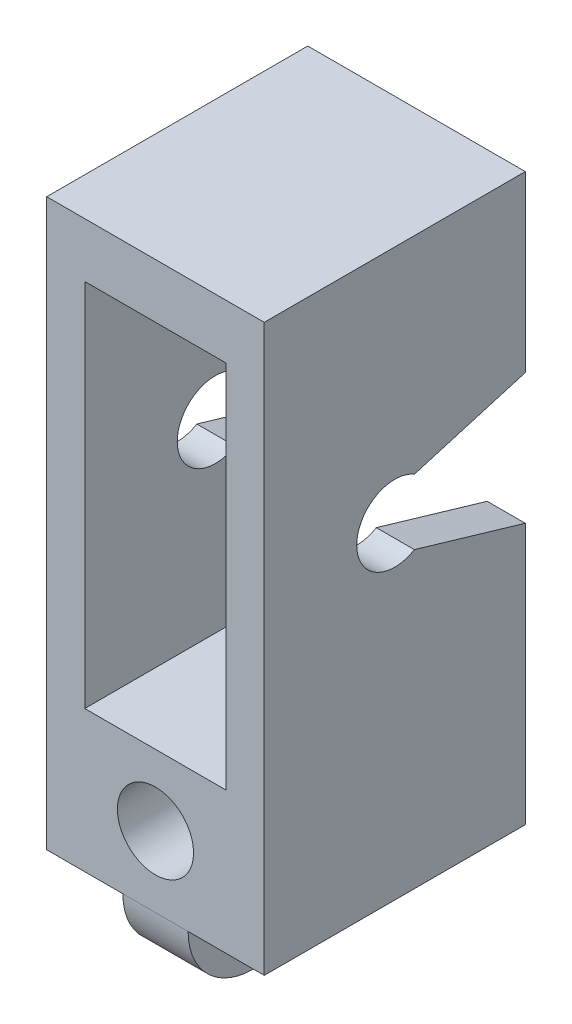
ISO-10303-21;
HEADER;
FILE_DESCRIPTION(('STEP AP214'),'2;1');
FILE_NAME('part.step','',(''),(''),'','','');
FILE_SCHEMA(('AUTOMOTIVE_DESIGN { 1 0 10303 214 1 1 1 1 }'));
ENDSEC;
DATA;
#1=APPLICATION_CONTEXT('core data for automotive mechanical design processes');
#2=APPLICATION_PROTOCOL_DEFINITION('international standard','automotive_design',2000,#1);
#3=PRODUCT_CONTEXT('',#1,'mechanical');
#4=PRODUCT('Part','Part','',(#3));
#5=PRODUCT_RELATED_PRODUCT_CATEGORY('part','',(#4));
#6=PRODUCT_DEFINITION_FORMATION('','',#4);
#7=PRODUCT_DEFINITION_CONTEXT('part definition',#1,'design');
#8=PRODUCT_DEFINITION('design','',#6,#7);
#9=PRODUCT_DEFINITION_SHAPE('','',#8);
#10=(LENGTH_UNIT() NAMED_UNIT(*) SI_UNIT(.MILLI.,.METRE.));
#11=(NAMED_UNIT(*) PLANE_ANGLE_UNIT() SI_UNIT($,.RADIAN.));
#12=(NAMED_UNIT(*) SI_UNIT($,.STERADIAN.) SOLID_ANGLE_UNIT());
#13=UNCERTAINTY_MEASURE_WITH_UNIT(LENGTH_MEASURE(1.E-05),#10,'distance_accuracy_value','');
#14=(GEOMETRIC_REPRESENTATION_CONTEXT(3) GLOBAL_UNCERTAINTY_ASSIGNED_CONTEXT((#13)) GLOBAL_UNIT_ASSIGNED_CONTEXT((#10,
#11,#12)) REPRESENTATION_CONTEXT('',''));
#15=CARTESIAN_POINT('',(0.,0.,0.));
#16=DIRECTION('',(0.,0.,1.));
#17=DIRECTION('',(1.,0.,0.));
#18=AXIS2_PLACEMENT_3D('',#15,#16,#17);
#19=CARTESIAN_POINT('',(5.,0.,-6.));
#20=DIRECTION('',(0.,0.,1.));
#21=DIRECTION('',(1.,0.,0.));
#22=AXIS2_PLACEMENT_3D('',#19,#20,#21);
#23=PLANE('',#22);
#24=DIRECTION('',(0.,-1.,0.));
#25=VECTOR('',#24,1.);
#26=CARTESIAN_POINT('',(1.5,5.,-6.));
#27=LINE('',#26,#25);
#28=CARTESIAN_POINT('',(1.5,6.5,-6.));
#29=VERTEX_POINT('',#28);
#30=CARTESIAN_POINT('',(1.5,5.,-6.));
#31=VERTEX_POINT('',#30);
#32=EDGE_CURVE('E287',#29,#31,#27,.T.);
#33=ORIENTED_EDGE('',*,*,#32,.F.);
#34=DIRECTION('',(1.,0.,0.));
#35=VECTOR('',#34,1.);
#36=CARTESIAN_POINT('',(5.,6.5,-6.));
#37=LINE('',#36,#35);
#38=CARTESIAN_POINT('',(3.25,6.5,-6.));
#39=VERTEX_POINT('',#38);
#40=EDGE_CURVE('E364',#29,#39,#37,.T.);
#41=ORIENTED_EDGE('',*,*,#40,.T.);
#42=DIRECTION('',(0.,1.,0.));
#43=VECTOR('',#42,1.);
#44=CARTESIAN_POINT('',(3.25,0.,-6.));
#45=LINE('',#44,#43);
#46=CARTESIAN_POINT('',(3.25,12.,-6.));
#47=VERTEX_POINT('',#46);
#48=EDGE_CURVE('E386',#39,#47,#45,.T.);
#49=ORIENTED_EDGE('',*,*,#48,.T.);
#50=DIRECTION('',(-1.,0.,0.));
#51=VECTOR('',#50,1.);
#52=CARTESIAN_POINT('',(5.,12.,-6.));
#53=LINE('',#52,#51);
#54=CARTESIAN_POINT('',(5.,12.,-6.));
#55=VERTEX_POINT('',#54);
#56=EDGE_CURVE('E472',#55,#47,#53,.T.);
#57=ORIENTED_EDGE('',*,*,#56,.F.);
#58=DIRECTION('',(0.,1.,0.));
#59=VECTOR('',#58,1.);
#60=CARTESIAN_POINT('',(5.,0.,-6.));
#61=LINE('',#60,#59);
#62=CARTESIAN_POINT('',(5.,0.,-6.));
#63=VERTEX_POINT('',#62);
#64=EDGE_CURVE('E408',#63,#55,#61,.T.);
#65=ORIENTED_EDGE('',*,*,#64,.F.);
#66=DIRECTION('',(-1.,0.,0.));
#67=VECTOR('',#66,1.);
#68=CARTESIAN_POINT('',(5.,0.,-6.));
#69=LINE('',#68,#67);
#70=CARTESIAN_POINT('',(1.5,0.,-6.));
#71=VERTEX_POINT('',#70);
#72=EDGE_CURVE('E447',#63,#71,#69,.T.);
#73=ORIENTED_EDGE('',*,*,#72,.T.);
#74=DIRECTION('',(0.,-1.,0.));
#75=VECTOR('',#74,1.);
#76=CARTESIAN_POINT('',(1.5,1.5,-6.));
#77=LINE('',#76,#75);
#78=CARTESIAN_POINT('',(1.5,1.5,-6.));
#79=VERTEX_POINT('',#78);
#80=EDGE_CURVE('E280',#79,#71,#77,.T.);
#81=ORIENTED_EDGE('',*,*,#80,.F.);
#82=DIRECTION('',(-1.,0.,0.));
#83=VECTOR('',#82,1.);
#84=CARTESIAN_POINT('',(1.5,1.5,-6.));
#85=LINE('',#84,#83);
#86=CARTESIAN_POINT('',(0.,1.5,-6.));
#87=VERTEX_POINT('',#86);
#88=EDGE_CURVE('E306',#79,#87,#85,.T.);
#89=ORIENTED_EDGE('',*,*,#88,.T.);
#90=CARTESIAN_POINT('',(0.,3.25,-6.));
#91=DIRECTION('',(0.,0.,1.));
#92=DIRECTION('',(1.,0.,0.));
#93=AXIS2_PLACEMENT_3D('',#90,#91,#92);
#94=CIRCLE('',#93,1.75);
#95=CARTESIAN_POINT('',(0.,5.,-6.));
#96=VERTEX_POINT('',#95);
#97=EDGE_CURVE('E314',#87,#96,#94,.T.);
#98=ORIENTED_EDGE('',*,*,#97,.T.);
#99=DIRECTION('',(-1.,0.,0.));
#100=VECTOR('',#99,1.);
#101=CARTESIAN_POINT('',(1.5,5.,-6.));
#102=LINE('',#101,#100);
#103=EDGE_CURVE('E297',#31,#96,#102,.T.);
#104=ORIENTED_EDGE('',*,*,#103,.F.);
#105=EDGE_LOOP('',(#33,#41,#49,#57,#65,#73,#81,#89,#98,#104));
#106=FACE_BOUND('',#105,.T.);
#107=ADVANCED_FACE('F33',(#106),#23,.F.);
#108=CARTESIAN_POINT('',(-1.5,5.,-6.));
#109=VERTEX_POINT('',#108);
#110=EDGE_CURVE('E289',#96,#109,#102,.T.);
#111=ORIENTED_EDGE('',*,*,#110,.F.);
#112=EDGE_CURVE('E315',#96,#87,#94,.T.);
#113=ORIENTED_EDGE('',*,*,#112,.T.);
#114=CARTESIAN_POINT('',(-1.5,1.5,-6.));
#115=VERTEX_POINT('',#114);
#116=EDGE_CURVE('E305',#87,#115,#85,.T.);
#117=ORIENTED_EDGE('',*,*,#116,.T.);
#118=DIRECTION('',(0.,-1.,0.));
#119=VECTOR('',#118,1.);
#120=CARTESIAN_POINT('',(-1.5,1.5,-6.));
#121=LINE('',#120,#119);
#122=CARTESIAN_POINT('',(-1.5,0.,-6.));
#123=VERTEX_POINT('',#122);
#124=EDGE_CURVE('E271',#115,#123,#121,.T.);
#125=ORIENTED_EDGE('',*,*,#124,.T.);
#126=CARTESIAN_POINT('',(-5.,0.,-6.));
#127=VERTEX_POINT('',#126);
#128=EDGE_CURVE('E426',#123,#127,#69,.T.);
#129=ORIENTED_EDGE('',*,*,#128,.T.);
#130=DIRECTION('',(0.,1.,0.));
#131=VECTOR('',#130,1.);
#132=CARTESIAN_POINT('',(-5.,0.,-6.));
#133=LINE('',#132,#131);
#134=CARTESIAN_POINT('',(-5.,12.,-6.));
#135=VERTEX_POINT('',#134);
#136=EDGE_CURVE('E407',#127,#135,#133,.T.);
#137=ORIENTED_EDGE('',*,*,#136,.T.);
#138=CARTESIAN_POINT('',(-3.25,12.,-6.));
#139=VERTEX_POINT('',#138);
#140=EDGE_CURVE('E471',#139,#135,#53,.T.);
#141=ORIENTED_EDGE('',*,*,#140,.F.);
#142=DIRECTION('',(0.,-1.,0.));
#143=VECTOR('',#142,1.);
#144=CARTESIAN_POINT('',(-3.25,0.,-6.));
#145=LINE('',#144,#143);
#146=CARTESIAN_POINT('',(-3.25,6.5,-6.));
#147=VERTEX_POINT('',#146);
#148=EDGE_CURVE('E404',#139,#147,#145,.T.);
#149=ORIENTED_EDGE('',*,*,#148,.T.);
#150=CARTESIAN_POINT('',(-1.5,6.5,-6.));
#151=VERTEX_POINT('',#150);
#152=EDGE_CURVE('E371',#147,#151,#37,.T.);
#153=ORIENTED_EDGE('',*,*,#152,.T.);
#154=DIRECTION('',(0.,-1.,0.));
#155=VECTOR('',#154,1.);
#156=CARTESIAN_POINT('',(-1.5,5.,-6.));
#157=LINE('',#156,#155);
#158=EDGE_CURVE('E281',#151,#109,#157,.T.);
#159=ORIENTED_EDGE('',*,*,#158,.T.);
#160=EDGE_LOOP('',(#111,#113,#117,#125,#129,#137,#141,#149,#153,#159));
#161=FACE_BOUND('',#160,.T.);
#162=ADVANCED_FACE('F515',(#161),#23,.F.);
#163=CARTESIAN_POINT('',(5.,13.5,-0.901387818865997));
#164=DIRECTION('',(0.,-0.95934470842308,0.282237011075151));
#165=DIRECTION('',(0.,-0.282237011075151,-0.95934470842308));
#166=AXIS2_PLACEMENT_3D('',#163,#164,#165);
#167=PLANE('',#166);
#168=DIRECTION('',(-1.,0.,0.));
#169=VECTOR('',#168,1.);
#170=CARTESIAN_POINT('',(5.,13.5,-0.901387818865997));
#171=LINE('',#170,#169);
#172=CARTESIAN_POINT('',(-3.25,13.5,-0.901387818865997));
#173=VERTEX_POINT('',#172);
#174=CARTESIAN_POINT('',(-5.,13.5,-0.901387818865997));
#175=VERTEX_POINT('',#174);
#176=EDGE_CURVE('E467',#173,#175,#171,.T.);
#177=ORIENTED_EDGE('',*,*,#176,.F.);
#178=DIRECTION('',(0.,-0.282237011075151,-0.95934470842308));
#179=VECTOR('',#178,1.);
#180=CARTESIAN_POINT('',(-3.25,13.5,-0.901387818865998));
#181=LINE('',#180,#179);
#182=EDGE_CURVE('E401',#173,#139,#181,.T.);
#183=ORIENTED_EDGE('',*,*,#182,.T.);
#184=ORIENTED_EDGE('',*,*,#140,.T.);
#185=DIRECTION('',(0.,0.282237011075151,0.95934470842308));
#186=VECTOR('',#185,1.);
#187=CARTESIAN_POINT('',(-5.,13.5,-0.901387818865997));
#188=LINE('',#187,#186);
#189=EDGE_CURVE('E429',#135,#175,#188,.T.);
#190=ORIENTED_EDGE('',*,*,#189,.T.);
#191=EDGE_LOOP('',(#177,#183,#184,#190));
#192=FACE_BOUND('',#191,.T.);
#193=ADVANCED_FACE('F521',(#192),#167,.F.);
#194=CARTESIAN_POINT('',(5.,15.,0.));
#195=DIRECTION('',(-1.,0.,0.));
#196=DIRECTION('',(0.,0.,1.));
#197=AXIS2_PLACEMENT_3D('',#194,#195,#196);
#198=CYLINDRICAL_SURFACE('',#197,1.75);
#199=DIRECTION('',(-1.,0.,0.));
#200=VECTOR('',#199,1.);
#201=CARTESIAN_POINT('',(5.,16.5,-0.901387818865997));
#202=LINE('',#201,#200);
#203=CARTESIAN_POINT('',(-3.25,16.5,-0.901387818865997));
#204=VERTEX_POINT('',#203);
#205=CARTESIAN_POINT('',(-5.,16.5,-0.901387818865997));
#206=VERTEX_POINT('',#205);
#207=EDGE_CURVE('E463',#204,#206,#202,.T.);
#208=ORIENTED_EDGE('',*,*,#207,.F.);
#209=CARTESIAN_POINT('',(-3.25,15.,0.));
#210=DIRECTION('',(-1.,0.,0.));
#211=DIRECTION('',(0.,-1.,0.));
#212=AXIS2_PLACEMENT_3D('',#209,#210,#211);
#213=CIRCLE('',#212,1.75);
#214=EDGE_CURVE('E398',#204,#173,#213,.F.);
#215=ORIENTED_EDGE('',*,*,#214,.T.);
#216=ORIENTED_EDGE('',*,*,#176,.T.);
#217=CARTESIAN_POINT('',(-5.,15.,0.));
#218=DIRECTION('',(-1.,0.,0.));
#219=DIRECTION('',(0.,0.,-1.));
#220=AXIS2_PLACEMENT_3D('',#217,#218,#219);
#221=CIRCLE('',#220,1.75);
#222=EDGE_CURVE('E432',#175,#206,#221,.T.);
#223=ORIENTED_EDGE('',*,*,#222,.T.);
#224=EDGE_LOOP('',(#208,#215,#216,#223));
#225=FACE_BOUND('',#224,.T.);
#226=ADVANCED_FACE('F547',(#225),#198,.F.);
#227=CARTESIAN_POINT('',(5.,16.5,-0.901387818865997));
#228=DIRECTION('',(0.,0.95934470842308,0.282237011075151));
#229=DIRECTION('',(0.,-0.282237011075151,0.95934470842308));
#230=AXIS2_PLACEMENT_3D('',#227,#228,#229);
#231=PLANE('',#230);
#232=DIRECTION('',(-1.,0.,0.));
#233=VECTOR('',#232,1.);
#234=CARTESIAN_POINT('',(5.,18.,-6.));
#235=LINE('',#234,#233);
#236=CARTESIAN_POINT('',(-3.25,18.,-6.));
#237=VERTEX_POINT('',#236);
#238=CARTESIAN_POINT('',(-5.,18.,-6.));
#239=VERTEX_POINT('',#238);
#240=EDGE_CURVE('E459',#237,#239,#235,.T.);
#241=ORIENTED_EDGE('',*,*,#240,.F.);
#242=DIRECTION('',(0.,-0.282237011075151,0.95934470842308));
#243=VECTOR('',#242,1.);
#244=CARTESIAN_POINT('',(-3.25,16.5,-0.901387818865997));
#245=LINE('',#244,#243);
#246=EDGE_CURVE('E395',#237,#204,#245,.T.);
#247=ORIENTED_EDGE('',*,*,#246,.T.);
#248=ORIENTED_EDGE('',*,*,#207,.T.);
#249=DIRECTION('',(0.,0.282237011075151,-0.95934470842308));
#250=VECTOR('',#249,1.);
#251=CARTESIAN_POINT('',(-5.,16.5,-0.901387818865997));
#252=LINE('',#251,#250);
#253=EDGE_CURVE('E435',#206,#239,#252,.T.);
#254=ORIENTED_EDGE('',*,*,#253,.T.);
#255=EDGE_LOOP('',(#241,#247,#248,#254));
#256=FACE_BOUND('',#255,.T.);
#257=ADVANCED_FACE('F551',(#256),#231,.F.);
#258=ORIENTED_EDGE('',*,*,#56,.T.);
#259=DIRECTION('',(0.,0.282237011075151,0.95934470842308));
#260=VECTOR('',#259,1.);
#261=CARTESIAN_POINT('',(3.25,13.5,-0.901387818865998));
#262=LINE('',#261,#260);
#263=CARTESIAN_POINT('',(3.25,13.5,-0.901387818865997));
#264=VERTEX_POINT('',#263);
#265=EDGE_CURVE('E383',#47,#264,#262,.T.);
#266=ORIENTED_EDGE('',*,*,#265,.T.);
#267=CARTESIAN_POINT('',(5.,13.5,-0.901387818865997));
#268=VERTEX_POINT('',#267);
#269=EDGE_CURVE('E468',#268,#264,#171,.T.);
#270=ORIENTED_EDGE('',*,*,#269,.F.);
#271=DIRECTION('',(0.,0.282237011075151,0.95934470842308));
#272=VECTOR('',#271,1.);
#273=CARTESIAN_POINT('',(5.,13.5,-0.901387818865997));
#274=LINE('',#273,#272);
#275=EDGE_CURVE('E411',#55,#268,#274,.T.);
#276=ORIENTED_EDGE('',*,*,#275,.F.);
#277=EDGE_LOOP('',(#258,#266,#270,#276));
#278=FACE_BOUND('',#277,.T.);
#279=ADVANCED_FACE('F572',(#278),#167,.F.);
#280=ORIENTED_EDGE('',*,*,#269,.T.);
#281=CARTESIAN_POINT('',(3.25,15.,0.));
#282=DIRECTION('',(1.,0.,0.));
#283=DIRECTION('',(0.,1.,0.));
#284=AXIS2_PLACEMENT_3D('',#281,#282,#283);
#285=CIRCLE('',#284,1.75);
#286=CARTESIAN_POINT('',(3.25,16.5,-0.901387818865997));
#287=VERTEX_POINT('',#286);
#288=EDGE_CURVE('E380',#264,#287,#285,.F.);
#289=ORIENTED_EDGE('',*,*,#288,.T.);
#290=CARTESIAN_POINT('',(5.,16.5,-0.901387818865997));
#291=VERTEX_POINT('',#290);
#292=EDGE_CURVE('E464',#291,#287,#202,.T.);
#293=ORIENTED_EDGE('',*,*,#292,.F.);
#294=CARTESIAN_POINT('',(5.,15.,0.));
#295=DIRECTION('',(-1.,0.,0.));
#296=DIRECTION('',(0.,0.,-1.));
#297=AXIS2_PLACEMENT_3D('',#294,#295,#296);
#298=CIRCLE('',#297,1.75);
#299=EDGE_CURVE('E414',#268,#291,#298,.T.);
#300=ORIENTED_EDGE('',*,*,#299,.F.);
#301=EDGE_LOOP('',(#280,#289,#293,#300));
#302=FACE_BOUND('',#301,.T.);
#303=ADVANCED_FACE('F737',(#302),#198,.F.);
#304=ORIENTED_EDGE('',*,*,#292,.T.);
#305=DIRECTION('',(0.,0.282237011075151,-0.95934470842308));
#306=VECTOR('',#305,1.);
#307=CARTESIAN_POINT('',(3.25,16.5,-0.901387818865997));
#308=LINE('',#307,#306);
#309=CARTESIAN_POINT('',(3.25,18.,-6.));
#310=VERTEX_POINT('',#309);
#311=EDGE_CURVE('E377',#287,#310,#308,.T.);
#312=ORIENTED_EDGE('',*,*,#311,.T.);
#313=CARTESIAN_POINT('',(5.,18.,-6.));
#314=VERTEX_POINT('',#313);
#315=EDGE_CURVE('E460',#314,#310,#235,.T.);
#316=ORIENTED_EDGE('',*,*,#315,.F.);
#317=DIRECTION('',(0.,0.282237011075151,-0.95934470842308));
#318=VECTOR('',#317,1.);
#319=CARTESIAN_POINT('',(5.,16.5,-0.901387818865997));
#320=LINE('',#319,#318);
#321=EDGE_CURVE('E416',#291,#314,#320,.T.);
#322=ORIENTED_EDGE('',*,*,#321,.F.);
#323=EDGE_LOOP('',(#304,#312,#316,#322));
#324=FACE_BOUND('',#323,.T.);
#325=ADVANCED_FACE('F735',(#324),#231,.F.);
#326=CARTESIAN_POINT('',(5.,18.,-6.));
#327=DIRECTION('',(0.,0.,1.));
#328=DIRECTION('',(1.,0.,0.));
#329=AXIS2_PLACEMENT_3D('',#326,#327,#328);
#330=PLANE('',#329);
#331=DIRECTION('',(-1.,0.,0.));
#332=VECTOR('',#331,1.);
#333=CARTESIAN_POINT('',(5.,23.5,-6.));
#334=LINE('',#333,#332);
#335=CARTESIAN_POINT('',(3.25,23.5,-6.));
#336=VERTEX_POINT('',#335);
#337=CARTESIAN_POINT('',(-3.25,23.5,-6.));
#338=VERTEX_POINT('',#337);
#339=EDGE_CURVE('E389',#336,#338,#334,.T.);
#340=ORIENTED_EDGE('',*,*,#339,.T.);
#341=DIRECTION('',(0.,-1.,0.));
#342=VECTOR('',#341,1.);
#343=CARTESIAN_POINT('',(-3.25,18.,-6.));
#344=LINE('',#343,#342);
#345=EDGE_CURVE('E392',#338,#237,#344,.T.);
#346=ORIENTED_EDGE('',*,*,#345,.T.);
#347=ORIENTED_EDGE('',*,*,#240,.T.);
#348=DIRECTION('',(0.,1.,0.));
#349=VECTOR('',#348,1.);
#350=CARTESIAN_POINT('',(-5.,18.,-6.));
#351=LINE('',#350,#349);
#352=CARTESIAN_POINT('',(-5.,26.,-6.));
#353=VERTEX_POINT('',#352);
#354=EDGE_CURVE('E438',#239,#353,#351,.T.);
#355=ORIENTED_EDGE('',*,*,#354,.T.);
#356=DIRECTION('',(-1.,0.,0.));
#357=VECTOR('',#356,1.);
#358=CARTESIAN_POINT('',(5.,26.,-6.));
#359=LINE('',#358,#357);
#360=CARTESIAN_POINT('',(5.,26.,-6.));
#361=VERTEX_POINT('',#360);
#362=EDGE_CURVE('E456',#361,#353,#359,.T.);
#363=ORIENTED_EDGE('',*,*,#362,.F.);
#364=DIRECTION('',(0.,1.,0.));
#365=VECTOR('',#364,1.);
#366=CARTESIAN_POINT('',(5.,18.,-6.));
#367=LINE('',#366,#365);
#368=EDGE_CURVE('E418',#314,#361,#367,.T.);
#369=ORIENTED_EDGE('',*,*,#368,.F.);
#370=ORIENTED_EDGE('',*,*,#315,.T.);
#371=DIRECTION('',(0.,1.,0.));
#372=VECTOR('',#371,1.);
#373=CARTESIAN_POINT('',(3.25,18.,-6.));
#374=LINE('',#373,#372);
#375=EDGE_CURVE('E374',#310,#336,#374,.T.);
#376=ORIENTED_EDGE('',*,*,#375,.T.);
#377=EDGE_LOOP('',(#340,#346,#347,#355,#363,#369,#370,#376));
#378=FACE_BOUND('',#377,.T.);
#379=ADVANCED_FACE('F554',(#378),#330,.F.);
#380=CARTESIAN_POINT('',(5.,26.,-6.));
#381=DIRECTION('',(0.,-1.,0.));
#382=DIRECTION('',(0.,0.,-1.));
#383=AXIS2_PLACEMENT_3D('',#380,#381,#382);
#384=PLANE('',#383);
#385=DIRECTION('',(0.,0.,1.));
#386=VECTOR('',#385,1.);
#387=CARTESIAN_POINT('',(-5.,26.,-6.));
#388=LINE('',#387,#386);
#389=CARTESIAN_POINT('',(-5.,26.,6.));
#390=VERTEX_POINT('',#389);
#391=EDGE_CURVE('E440',#353,#390,#388,.T.);
#392=ORIENTED_EDGE('',*,*,#391,.T.);
#393=DIRECTION('',(-1.,0.,0.));
#394=VECTOR('',#393,1.);
#395=CARTESIAN_POINT('',(5.,26.,6.));
#396=LINE('',#395,#394);
#397=CARTESIAN_POINT('',(5.,26.,6.));
#398=VERTEX_POINT('',#397);
#399=EDGE_CURVE('E453',#398,#390,#396,.T.);
#400=ORIENTED_EDGE('',*,*,#399,.F.);
#401=DIRECTION('',(0.,0.,1.));
#402=VECTOR('',#401,1.);
#403=CARTESIAN_POINT('',(5.,26.,-6.));
#404=LINE('',#403,#402);
#405=EDGE_CURVE('E420',#361,#398,#404,.T.);
#406=ORIENTED_EDGE('',*,*,#405,.F.);
#407=ORIENTED_EDGE('',*,*,#362,.T.);
#408=EDGE_LOOP('',(#392,#400,#406,#407));
#409=FACE_BOUND('',#408,.T.);
#410=ADVANCED_FACE('F728',(#409),#384,.F.);
#411=CARTESIAN_POINT('',(5.,0.,6.));
#412=DIRECTION('',(0.,0.,-1.));
#413=DIRECTION('',(-1.,0.,0.));
#414=AXIS2_PLACEMENT_3D('',#411,#412,#413);
#415=PLANE('',#414);
#416=CARTESIAN_POINT('',(0.,3.25,6.));
#417=DIRECTION('',(0.,0.,-1.));
#418=DIRECTION('',(-1.,0.,0.));
#419=AXIS2_PLACEMENT_3D('',#416,#417,#418);
#420=CIRCLE('',#419,1.75);
#421=CARTESIAN_POINT('',(-1.75,3.25,6.));
#422=VERTEX_POINT('',#421);
#423=EDGE_CURVE('E311',#422,#422,#420,.T.);
#424=ORIENTED_EDGE('',*,*,#423,.T.);
#425=EDGE_LOOP('',(#424));
#426=FACE_BOUND('',#425,.T.);
#427=DIRECTION('',(1.,0.,0.));
#428=VECTOR('',#427,1.);
#429=CARTESIAN_POINT('',(-3.25,6.5,6.));
#430=LINE('',#429,#428);
#431=CARTESIAN_POINT('',(-3.25,6.5,6.));
#432=VERTEX_POINT('',#431);
#433=CARTESIAN_POINT('',(3.25,6.5,6.));
#434=VERTEX_POINT('',#433);
#435=EDGE_CURVE('E352',#432,#434,#430,.T.);
#436=ORIENTED_EDGE('',*,*,#435,.F.);
#437=DIRECTION('',(0.,-1.,0.));
#438=VECTOR('',#437,1.);
#439=CARTESIAN_POINT('',(-3.25,23.5,6.));
#440=LINE('',#439,#438);
#441=CARTESIAN_POINT('',(-3.25,23.5,6.));
#442=VERTEX_POINT('',#441);
#443=EDGE_CURVE('E344',#442,#432,#440,.T.);
#444=ORIENTED_EDGE('',*,*,#443,.F.);
#445=DIRECTION('',(-1.,0.,0.));
#446=VECTOR('',#445,1.);
#447=CARTESIAN_POINT('',(-3.25,23.5,6.));
#448=LINE('',#447,#446);
#449=CARTESIAN_POINT('',(3.25,23.5,6.));
#450=VERTEX_POINT('',#449);
#451=EDGE_CURVE('E358',#450,#442,#448,.T.);
#452=ORIENTED_EDGE('',*,*,#451,.F.);
#453=DIRECTION('',(0.,1.,0.));
#454=VECTOR('',#453,1.);
#455=CARTESIAN_POINT('',(3.25,23.5,6.));
#456=LINE('',#455,#454);
#457=EDGE_CURVE('E355',#434,#450,#456,.T.);
#458=ORIENTED_EDGE('',*,*,#457,.F.);
#459=EDGE_LOOP('',(#436,#444,#452,#458));
#460=FACE_BOUND('',#459,.T.);
#461=DIRECTION('',(0.,-1.,0.));
#462=VECTOR('',#461,1.);
#463=CARTESIAN_POINT('',(-5.,0.,6.));
#464=LINE('',#463,#462);
#465=CARTESIAN_POINT('',(-5.,0.,6.));
#466=VERTEX_POINT('',#465);
#467=EDGE_CURVE('E442',#390,#466,#464,.T.);
#468=ORIENTED_EDGE('',*,*,#467,.T.);
#469=DIRECTION('',(-1.,0.,0.));
#470=VECTOR('',#469,1.);
#471=CARTESIAN_POINT('',(5.,0.,6.));
#472=LINE('',#471,#470);
#473=CARTESIAN_POINT('',(-1.5,0.,6.));
#474=VERTEX_POINT('',#473);
#475=EDGE_CURVE('E450',#474,#466,#472,.T.);
#476=ORIENTED_EDGE('',*,*,#475,.F.);
#477=DIRECTION('',(-1.,0.,0.));
#478=VECTOR('',#477,1.);
#479=CARTESIAN_POINT('',(1.5,0.,6.));
#480=LINE('',#479,#478);
#481=CARTESIAN_POINT('',(1.5,0.,6.));
#482=VERTEX_POINT('',#481);
#483=EDGE_CURVE('E715',#482,#474,#480,.T.);
#484=ORIENTED_EDGE('',*,*,#483,.F.);
#485=CARTESIAN_POINT('',(5.,0.,6.));
#486=VERTEX_POINT('',#485);
#487=EDGE_CURVE('E451',#486,#482,#472,.T.);
#488=ORIENTED_EDGE('',*,*,#487,.F.);
#489=DIRECTION('',(0.,-1.,0.));
#490=VECTOR('',#489,1.);
#491=CARTESIAN_POINT('',(5.,0.,6.));
#492=LINE('',#491,#490);
#493=EDGE_CURVE('E422',#398,#486,#492,.T.);
#494=ORIENTED_EDGE('',*,*,#493,.F.);
#495=ORIENTED_EDGE('',*,*,#399,.T.);
#496=EDGE_LOOP('',(#468,#476,#484,#488,#494,#495));
#497=FACE_BOUND('',#496,.T.);
#498=ADVANCED_FACE('F565',(#426,#460,#497),#415,.F.);
#499=CARTESIAN_POINT('',(5.,0.,6.));
#500=DIRECTION('',(0.,1.,0.));
#501=DIRECTION('',(0.,0.,1.));
#502=AXIS2_PLACEMENT_3D('',#499,#500,#501);
#503=PLANE('',#502);
#504=DIRECTION('',(-1.,0.,0.));
#505=VECTOR('',#504,1.);
#506=CARTESIAN_POINT('',(1.5,0.,1.6));
#507=LINE('',#506,#505);
#508=CARTESIAN_POINT('',(1.5,0.,1.6));
#509=VERTEX_POINT('',#508);
#510=CARTESIAN_POINT('',(-1.5,0.,1.6));
#511=VERTEX_POINT('',#510);
#512=EDGE_CURVE('E56',#509,#511,#507,.T.);
#513=ORIENTED_EDGE('',*,*,#512,.F.);
#514=DIRECTION('',(0.,0.,1.));
#515=VECTOR('',#514,1.);
#516=CARTESIAN_POINT('',(1.5,0.,1.6));
#517=LINE('',#516,#515);
#518=CARTESIAN_POINT('',(1.5,0.,0.));
#519=VERTEX_POINT('',#518);
#520=EDGE_CURVE('E250',#519,#509,#517,.T.);
#521=ORIENTED_EDGE('',*,*,#520,.F.);
#522=DIRECTION('',(1.,0.,0.));
#523=VECTOR('',#522,1.);
#524=CARTESIAN_POINT('',(-2.75,0.,0.));
#525=LINE('',#524,#523);
#526=CARTESIAN_POINT('',(2.75,0.,0.));
#527=VERTEX_POINT('',#526);
#528=EDGE_CURVE('E237',#519,#527,#525,.T.);
#529=ORIENTED_EDGE('',*,*,#528,.T.);
#530=DIRECTION('',(0.,0.,1.));
#531=VECTOR('',#530,1.);
#532=CARTESIAN_POINT('',(2.75,0.,-2.5));
#533=LINE('',#532,#531);
#534=CARTESIAN_POINT('',(2.75,0.,-2.5));
#535=VERTEX_POINT('',#534);
#536=EDGE_CURVE('E347',#535,#527,#533,.T.);
#537=ORIENTED_EDGE('',*,*,#536,.F.);
#538=DIRECTION('',(1.,0.,0.));
#539=VECTOR('',#538,1.);
#540=CARTESIAN_POINT('',(-2.75,0.,-2.5));
#541=LINE('',#540,#539);
#542=CARTESIAN_POINT('',(-2.75,0.,-2.5));
#543=VERTEX_POINT('',#542);
#544=EDGE_CURVE('E321',#543,#535,#541,.T.);
#545=ORIENTED_EDGE('',*,*,#544,.F.);
#546=DIRECTION('',(0.,0.,1.));
#547=VECTOR('',#546,1.);
#548=CARTESIAN_POINT('',(-2.75,0.,-2.5));
#549=LINE('',#548,#547);
#550=CARTESIAN_POINT('',(-2.75,0.,0.));
#551=VERTEX_POINT('',#550);
#552=EDGE_CURVE('E333',#543,#551,#549,.T.);
#553=ORIENTED_EDGE('',*,*,#552,.T.);
#554=CARTESIAN_POINT('',(-1.5,0.,0.));
#555=VERTEX_POINT('',#554);
#556=EDGE_CURVE('E247',#551,#555,#525,.T.);
#557=ORIENTED_EDGE('',*,*,#556,.T.);
#558=DIRECTION('',(0.,0.,1.));
#559=VECTOR('',#558,1.);
#560=CARTESIAN_POINT('',(-1.5,0.,1.6));
#561=LINE('',#560,#559);
#562=EDGE_CURVE('E705',#555,#511,#561,.T.);
#563=ORIENTED_EDGE('',*,*,#562,.T.);
#564=EDGE_LOOP('',(#513,#521,#529,#537,#545,#553,#557,#563));
#565=FACE_BOUND('',#564,.T.);
#566=ORIENTED_EDGE('',*,*,#487,.T.);
#567=DIRECTION('',(0.,0.,1.));
#568=VECTOR('',#567,1.);
#569=CARTESIAN_POINT('',(1.5,0.,4.4));
#570=LINE('',#569,#568);
#571=CARTESIAN_POINT('',(1.5,0.,4.4));
#572=VERTEX_POINT('',#571);
#573=EDGE_CURVE('E48',#572,#482,#570,.T.);
#574=ORIENTED_EDGE('',*,*,#573,.F.);
#575=DIRECTION('',(-1.,0.,0.));
#576=VECTOR('',#575,1.);
#577=CARTESIAN_POINT('',(1.5,0.,4.4));
#578=LINE('',#577,#576);
#579=CARTESIAN_POINT('',(-1.5,0.,4.4));
#580=VERTEX_POINT('',#579);
#581=EDGE_CURVE('E273',#572,#580,#578,.T.);
#582=ORIENTED_EDGE('',*,*,#581,.T.);
#583=DIRECTION('',(0.,0.,1.));
#584=VECTOR('',#583,1.);
#585=CARTESIAN_POINT('',(-1.5,0.,4.4));
#586=LINE('',#585,#584);
#587=EDGE_CURVE('E262',#580,#474,#586,.T.);
#588=ORIENTED_EDGE('',*,*,#587,.T.);
#589=ORIENTED_EDGE('',*,*,#475,.T.);
#590=DIRECTION('',(0.,0.,-1.));
#591=VECTOR('',#590,1.);
#592=CARTESIAN_POINT('',(-5.,0.,6.));
#593=LINE('',#592,#591);
#594=EDGE_CURVE('E412',#466,#127,#593,.T.);
#595=ORIENTED_EDGE('',*,*,#594,.T.);
#596=ORIENTED_EDGE('',*,*,#128,.F.);
#597=DIRECTION('',(-1.,0.,0.));
#598=VECTOR('',#597,1.);
#599=CARTESIAN_POINT('',(1.5,0.,-6.));
#600=LINE('',#599,#598);
#601=EDGE_CURVE('E302',#71,#123,#600,.T.);
#602=ORIENTED_EDGE('',*,*,#601,.F.);
#603=ORIENTED_EDGE('',*,*,#72,.F.);
#604=DIRECTION('',(0.,0.,-1.));
#605=VECTOR('',#604,1.);
#606=CARTESIAN_POINT('',(5.,0.,6.));
#607=LINE('',#606,#605);
#608=EDGE_CURVE('E424',#486,#63,#607,.T.);
#609=ORIENTED_EDGE('',*,*,#608,.F.);
#610=EDGE_LOOP('',(#566,#574,#582,#588,#589,#595,#596,#602,#603,#609));
#611=FACE_BOUND('',#610,.T.);
#612=ADVANCED_FACE('F252',(#565,#611),#503,.F.);
#613=CARTESIAN_POINT('',(5.,15.,0.));
#614=DIRECTION('',(1.,0.,0.));
#615=DIRECTION('',(0.,0.,-1.));
#616=AXIS2_PLACEMENT_3D('',#613,#614,#615);
#617=PLANE('',#616);
#618=ORIENTED_EDGE('',*,*,#64,.T.);
#619=ORIENTED_EDGE('',*,*,#275,.T.);
#620=ORIENTED_EDGE('',*,*,#299,.T.);
#621=ORIENTED_EDGE('',*,*,#321,.T.);
#622=ORIENTED_EDGE('',*,*,#368,.T.);
#623=ORIENTED_EDGE('',*,*,#405,.T.);
#624=ORIENTED_EDGE('',*,*,#493,.T.);
#625=ORIENTED_EDGE('',*,*,#608,.T.);
#626=EDGE_LOOP('',(#618,#619,#620,#621,#622,#623,#624,#625));
#627=FACE_BOUND('',#626,.T.);
#628=ADVANCED_FACE('F576',(#627),#617,.T.);
#629=CARTESIAN_POINT('',(-5.,15.,0.));
#630=DIRECTION('',(1.,0.,0.));
#631=DIRECTION('',(0.,0.,-1.));
#632=AXIS2_PLACEMENT_3D('',#629,#630,#631);
#633=PLANE('',#632);
#634=ORIENTED_EDGE('',*,*,#136,.F.);
#635=ORIENTED_EDGE('',*,*,#594,.F.);
#636=ORIENTED_EDGE('',*,*,#467,.F.);
#637=ORIENTED_EDGE('',*,*,#391,.F.);
#638=ORIENTED_EDGE('',*,*,#354,.F.);
#639=ORIENTED_EDGE('',*,*,#253,.F.);
#640=ORIENTED_EDGE('',*,*,#222,.F.);
#641=ORIENTED_EDGE('',*,*,#189,.F.);
#642=EDGE_LOOP('',(#634,#635,#636,#637,#638,#639,#640,#641));
#643=FACE_BOUND('',#642,.T.);
#644=ADVANCED_FACE('F726',(#643),#633,.F.);
#645=CARTESIAN_POINT('',(-3.25,23.5,-14.));
#646=DIRECTION('',(-1.,0.,0.));
#647=DIRECTION('',(0.,-1.,0.));
#648=AXIS2_PLACEMENT_3D('',#645,#646,#647);
#649=PLANE('',#648);
#650=ORIENTED_EDGE('',*,*,#182,.F.);
#651=ORIENTED_EDGE('',*,*,#214,.F.);
#652=ORIENTED_EDGE('',*,*,#246,.F.);
#653=ORIENTED_EDGE('',*,*,#345,.F.);
#654=DIRECTION('',(0.,0.,1.));
#655=VECTOR('',#654,1.);
#656=CARTESIAN_POINT('',(-3.25,23.5,-14.));
#657=LINE('',#656,#655);
#658=EDGE_CURVE('E362',#338,#442,#657,.T.);
#659=ORIENTED_EDGE('',*,*,#658,.T.);
#660=ORIENTED_EDGE('',*,*,#443,.T.);
#661=DIRECTION('',(0.,0.,1.));
#662=VECTOR('',#661,1.);
#663=CARTESIAN_POINT('',(-3.25,6.5,-14.));
#664=LINE('',#663,#662);
#665=EDGE_CURVE('E361',#147,#432,#664,.T.);
#666=ORIENTED_EDGE('',*,*,#665,.F.);
#667=ORIENTED_EDGE('',*,*,#148,.F.);
#668=EDGE_LOOP('',(#650,#651,#652,#653,#659,#660,#666,#667));
#669=FACE_BOUND('',#668,.T.);
#670=ADVANCED_FACE('F540',(#669),#649,.F.);
#671=CARTESIAN_POINT('',(-3.25,23.5,-14.));
#672=DIRECTION('',(0.,1.,0.));
#673=DIRECTION('',(0.,0.,1.));
#674=AXIS2_PLACEMENT_3D('',#671,#672,#673);
#675=PLANE('',#674);
#676=DIRECTION('',(0.,0.,1.));
#677=VECTOR('',#676,1.);
#678=CARTESIAN_POINT('',(3.25,23.5,-14.));
#679=LINE('',#678,#677);
#680=EDGE_CURVE('E365',#336,#450,#679,.T.);
#681=ORIENTED_EDGE('',*,*,#680,.T.);
#682=ORIENTED_EDGE('',*,*,#451,.T.);
#683=ORIENTED_EDGE('',*,*,#658,.F.);
#684=ORIENTED_EDGE('',*,*,#339,.F.);
#685=EDGE_LOOP('',(#681,#682,#683,#684));
#686=FACE_BOUND('',#685,.T.);
#687=ADVANCED_FACE('F559',(#686),#675,.F.);
#688=CARTESIAN_POINT('',(3.25,23.5,-14.));
#689=DIRECTION('',(1.,0.,0.));
#690=DIRECTION('',(0.,1.,0.));
#691=AXIS2_PLACEMENT_3D('',#688,#689,#690);
#692=PLANE('',#691);
#693=DIRECTION('',(0.,0.,1.));
#694=VECTOR('',#693,1.);
#695=CARTESIAN_POINT('',(3.25,6.5,-14.));
#696=LINE('',#695,#694);
#697=EDGE_CURVE('E367',#39,#434,#696,.T.);
#698=ORIENTED_EDGE('',*,*,#697,.T.);
#699=ORIENTED_EDGE('',*,*,#457,.T.);
#700=ORIENTED_EDGE('',*,*,#680,.F.);
#701=ORIENTED_EDGE('',*,*,#375,.F.);
#702=ORIENTED_EDGE('',*,*,#311,.F.);
#703=ORIENTED_EDGE('',*,*,#288,.F.);
#704=ORIENTED_EDGE('',*,*,#265,.F.);
#705=ORIENTED_EDGE('',*,*,#48,.F.);
#706=EDGE_LOOP('',(#698,#699,#700,#701,#702,#703,#704,#705));
#707=FACE_BOUND('',#706,.T.);
#708=ADVANCED_FACE('F568',(#707),#692,.F.);
#709=CARTESIAN_POINT('',(-3.25,6.5,-14.));
#710=DIRECTION('',(0.,-1.,0.));
#711=DIRECTION('',(1.,0.,0.));
#712=AXIS2_PLACEMENT_3D('',#709,#710,#711);
#713=PLANE('',#712);
#714=DIRECTION('',(0.,0.,-1.));
#715=VECTOR('',#714,1.);
#716=CARTESIAN_POINT('',(-0.470834875401148,6.5,-14.));
#717=LINE('',#716,#715);
#718=CARTESIAN_POINT('',(-0.470834875401149,6.5,0.));
#719=VERTEX_POINT('',#718);
#720=CARTESIAN_POINT('',(-0.470834875401149,6.5,-2.5));
#721=VERTEX_POINT('',#720);
#722=EDGE_CURVE('E41',#719,#721,#717,.T.);
#723=ORIENTED_EDGE('',*,*,#722,.T.);
#724=DIRECTION('',(1.,0.,0.));
#725=VECTOR('',#724,1.);
#726=CARTESIAN_POINT('',(-3.25,6.5,-2.5));
#727=LINE('',#726,#725);
#728=CARTESIAN_POINT('',(0.470834875401149,6.5,-2.5));
#729=VERTEX_POINT('',#728);
#730=EDGE_CURVE('E11',#721,#729,#727,.T.);
#731=ORIENTED_EDGE('',*,*,#730,.T.);
#732=DIRECTION('',(0.,0.,1.));
#733=VECTOR('',#732,1.);
#734=CARTESIAN_POINT('',(0.470834875401151,6.5,-14.));
#735=LINE('',#734,#733);
#736=CARTESIAN_POINT('',(0.470834875401149,6.5,0.));
#737=VERTEX_POINT('',#736);
#738=EDGE_CURVE('E477',#729,#737,#735,.T.);
#739=ORIENTED_EDGE('',*,*,#738,.T.);
#740=DIRECTION('',(1.,0.,0.));
#741=VECTOR('',#740,1.);
#742=CARTESIAN_POINT('',(-3.25,6.5,0.));
#743=LINE('',#742,#741);
#744=EDGE_CURVE('E475',#719,#737,#743,.T.);
#745=ORIENTED_EDGE('',*,*,#744,.F.);
#746=EDGE_LOOP('',(#723,#731,#739,#745));
#747=FACE_BOUND('',#746,.T.);
#748=ORIENTED_EDGE('',*,*,#665,.T.);
#749=ORIENTED_EDGE('',*,*,#435,.T.);
#750=ORIENTED_EDGE('',*,*,#697,.F.);
#751=ORIENTED_EDGE('',*,*,#40,.F.);
#752=DIRECTION('',(-1.,0.,0.));
#753=VECTOR('',#752,1.);
#754=CARTESIAN_POINT('',(1.5,6.5,-6.));
#755=LINE('',#754,#753);
#756=EDGE_CURVE('E300',#29,#151,#755,.T.);
#757=ORIENTED_EDGE('',*,*,#756,.T.);
#758=ORIENTED_EDGE('',*,*,#152,.F.);
#759=EDGE_LOOP('',(#748,#749,#750,#751,#757,#758));
#760=FACE_BOUND('',#759,.T.);
#761=ADVANCED_FACE('F484',(#747,#760),#713,.F.);
#762=CARTESIAN_POINT('',(0.,6.77183664205672,-2.5));
#763=DIRECTION('',(-0.5,0.866025403784438,0.));
#764=DIRECTION('',(-0.866025403784438,-0.5,0.));
#765=AXIS2_PLACEMENT_3D('',#762,#763,#764);
#766=PLANE('',#765);
#767=DIRECTION('',(-0.866025403784438,-0.5,0.));
#768=VECTOR('',#767,1.);
#769=CARTESIAN_POINT('',(0.,6.77183664205672,0.));
#770=LINE('',#769,#768);
#771=CARTESIAN_POINT('',(-2.75,5.18412340178524,0.));
#772=VERTEX_POINT('',#771);
#773=EDGE_CURVE('E322',#719,#772,#770,.T.);
#774=ORIENTED_EDGE('',*,*,#773,.T.);
#775=DIRECTION('',(0.,0.,1.));
#776=VECTOR('',#775,1.);
#777=CARTESIAN_POINT('',(-2.75,5.18412340178524,-2.5));
#778=LINE('',#777,#776);
#779=CARTESIAN_POINT('',(-2.75,5.18412340178524,-2.5));
#780=VERTEX_POINT('',#779);
#781=EDGE_CURVE('E341',#780,#772,#778,.T.);
#782=ORIENTED_EDGE('',*,*,#781,.F.);
#783=DIRECTION('',(-0.866025403784438,-0.5,0.));
#784=VECTOR('',#783,1.);
#785=CARTESIAN_POINT('',(0.,6.77183664205672,-2.5));
#786=LINE('',#785,#784);
#787=EDGE_CURVE('E331',#721,#780,#786,.T.);
#788=ORIENTED_EDGE('',*,*,#787,.F.);
#789=ORIENTED_EDGE('',*,*,#722,.F.);
#790=EDGE_LOOP('',(#774,#782,#788,#789));
#791=FACE_BOUND('',#790,.T.);
#792=ADVANCED_FACE('F488',(#791),#766,.F.);
#793=CARTESIAN_POINT('',(2.75,5.18412340178525,-2.5));
#794=DIRECTION('',(0.5,0.866025403784439,0.));
#795=DIRECTION('',(-0.866025403784439,0.5,0.));
#796=AXIS2_PLACEMENT_3D('',#793,#794,#795);
#797=PLANE('',#796);
#798=DIRECTION('',(-0.866025403784439,0.5,0.));
#799=VECTOR('',#798,1.);
#800=CARTESIAN_POINT('',(2.75,5.18412340178525,-2.5));
#801=LINE('',#800,#799);
#802=CARTESIAN_POINT('',(2.75,5.18412340178525,-2.5));
#803=VERTEX_POINT('',#802);
#804=EDGE_CURVE('E328',#803,#729,#801,.T.);
#805=ORIENTED_EDGE('',*,*,#804,.F.);
#806=DIRECTION('',(0.,0.,1.));
#807=VECTOR('',#806,1.);
#808=CARTESIAN_POINT('',(2.75,5.18412340178525,-2.5));
#809=LINE('',#808,#807);
#810=CARTESIAN_POINT('',(2.75,5.18412340178525,0.));
#811=VERTEX_POINT('',#810);
#812=EDGE_CURVE('E345',#803,#811,#809,.T.);
#813=ORIENTED_EDGE('',*,*,#812,.T.);
#814=DIRECTION('',(-0.866025403784439,0.5,0.));
#815=VECTOR('',#814,1.);
#816=CARTESIAN_POINT('',(2.75,5.18412340178525,0.));
#817=LINE('',#816,#815);
#818=EDGE_CURVE('E337',#811,#737,#817,.T.);
#819=ORIENTED_EDGE('',*,*,#818,.T.);
#820=ORIENTED_EDGE('',*,*,#738,.F.);
#821=EDGE_LOOP('',(#805,#813,#819,#820));
#822=FACE_BOUND('',#821,.T.);
#823=ADVANCED_FACE('F496',(#822),#797,.F.);
#824=CARTESIAN_POINT('',(0.,0.,-2.5));
#825=DIRECTION('',(0.,0.,-1.));
#826=DIRECTION('',(-1.,0.,0.));
#827=AXIS2_PLACEMENT_3D('',#824,#825,#826);
#828=PLANE('',#827);
#829=CARTESIAN_POINT('',(0.,3.25,-2.5));
#830=DIRECTION('',(0.,0.,-1.));
#831=DIRECTION('',(-1.,0.,0.));
#832=AXIS2_PLACEMENT_3D('',#829,#830,#831);
#833=CIRCLE('',#832,1.75);
#834=CARTESIAN_POINT('',(-1.75,3.25,-2.5));
#835=VERTEX_POINT('',#834);
#836=EDGE_CURVE('E308',#835,#835,#833,.T.);
#837=ORIENTED_EDGE('',*,*,#836,.T.);
#838=EDGE_LOOP('',(#837));
#839=FACE_BOUND('',#838,.T.);
#840=ORIENTED_EDGE('',*,*,#787,.T.);
#841=DIRECTION('',(0.,-1.,0.));
#842=VECTOR('',#841,1.);
#843=CARTESIAN_POINT('',(-2.75,0.,-2.5));
#844=LINE('',#843,#842);
#845=EDGE_CURVE('E318',#780,#543,#844,.T.);
#846=ORIENTED_EDGE('',*,*,#845,.T.);
#847=ORIENTED_EDGE('',*,*,#544,.T.);
#848=DIRECTION('',(0.,1.,0.));
#849=VECTOR('',#848,1.);
#850=CARTESIAN_POINT('',(2.75,0.,-2.5));
#851=LINE('',#850,#849);
#852=EDGE_CURVE('E325',#535,#803,#851,.T.);
#853=ORIENTED_EDGE('',*,*,#852,.T.);
#854=ORIENTED_EDGE('',*,*,#804,.T.);
#855=ORIENTED_EDGE('',*,*,#730,.F.);
#856=EDGE_LOOP('',(#840,#846,#847,#853,#854,#855));
#857=FACE_BOUND('',#856,.T.);
#858=ADVANCED_FACE('F492',(#839,#857),#828,.F.);
#859=CARTESIAN_POINT('',(0.,0.,0.));
#860=DIRECTION('',(0.,0.,-1.));
#861=DIRECTION('',(-1.,0.,0.));
#862=AXIS2_PLACEMENT_3D('',#859,#860,#861);
#863=PLANE('',#862);
#864=CARTESIAN_POINT('',(0.,3.25,0.));
#865=DIRECTION('',(0.,0.,-1.));
#866=DIRECTION('',(-1.,0.,0.));
#867=AXIS2_PLACEMENT_3D('',#864,#865,#866);
#868=CIRCLE('',#867,1.75);
#869=CARTESIAN_POINT('',(-1.75,3.25,0.));
#870=VERTEX_POINT('',#869);
#871=EDGE_CURVE('E36',#870,#870,#868,.T.);
#872=ORIENTED_EDGE('',*,*,#871,.F.);
#873=EDGE_LOOP('',(#872));
#874=FACE_BOUND('',#873,.T.);
#875=ORIENTED_EDGE('',*,*,#744,.T.);
#876=ORIENTED_EDGE('',*,*,#818,.F.);
#877=DIRECTION('',(0.,1.,0.));
#878=VECTOR('',#877,1.);
#879=CARTESIAN_POINT('',(2.75,0.,0.));
#880=LINE('',#879,#878);
#881=EDGE_CURVE('E244',#527,#811,#880,.T.);
#882=ORIENTED_EDGE('',*,*,#881,.F.);
#883=ORIENTED_EDGE('',*,*,#528,.F.);
#884=DIRECTION('',(-1.,0.,0.));
#885=VECTOR('',#884,1.);
#886=CARTESIAN_POINT('',(1.5,0.,0.));
#887=LINE('',#886,#885);
#888=EDGE_CURVE('E240',#519,#555,#887,.T.);
#889=ORIENTED_EDGE('',*,*,#888,.T.);
#890=ORIENTED_EDGE('',*,*,#556,.F.);
#891=DIRECTION('',(0.,-1.,0.));
#892=VECTOR('',#891,1.);
#893=CARTESIAN_POINT('',(-2.75,0.,0.));
#894=LINE('',#893,#892);
#895=EDGE_CURVE('E248',#772,#551,#894,.T.);
#896=ORIENTED_EDGE('',*,*,#895,.F.);
#897=ORIENTED_EDGE('',*,*,#773,.F.);
#898=EDGE_LOOP('',(#875,#876,#882,#883,#889,#890,#896,#897));
#899=FACE_BOUND('',#898,.T.);
#900=ADVANCED_FACE('F238',(#874,#899),#863,.T.);
#901=CARTESIAN_POINT('',(-2.75,0.,-2.5));
#902=DIRECTION('',(-1.,0.,0.));
#903=DIRECTION('',(0.,-1.,0.));
#904=AXIS2_PLACEMENT_3D('',#901,#902,#903);
#905=PLANE('',#904);
#906=ORIENTED_EDGE('',*,*,#895,.T.);
#907=ORIENTED_EDGE('',*,*,#552,.F.);
#908=ORIENTED_EDGE('',*,*,#845,.F.);
#909=ORIENTED_EDGE('',*,*,#781,.T.);
#910=EDGE_LOOP('',(#906,#907,#908,#909));
#911=FACE_BOUND('',#910,.T.);
#912=ADVANCED_FACE('F501',(#911),#905,.F.);
#913=CARTESIAN_POINT('',(2.75,0.,-2.5));
#914=DIRECTION('',(1.,0.,0.));
#915=DIRECTION('',(0.,0.,-1.));
#916=AXIS2_PLACEMENT_3D('',#913,#914,#915);
#917=PLANE('',#916);
#918=ORIENTED_EDGE('',*,*,#881,.T.);
#919=ORIENTED_EDGE('',*,*,#812,.F.);
#920=ORIENTED_EDGE('',*,*,#852,.F.);
#921=ORIENTED_EDGE('',*,*,#536,.T.);
#922=EDGE_LOOP('',(#918,#919,#920,#921));
#923=FACE_BOUND('',#922,.T.);
#924=ADVANCED_FACE('F498',(#923),#917,.F.);
#925=CARTESIAN_POINT('',(0.,3.25,-10.));
#926=DIRECTION('',(0.,0.,1.));
#927=DIRECTION('',(1.,0.,0.));
#928=AXIS2_PLACEMENT_3D('',#925,#926,#927);
#929=CYLINDRICAL_SURFACE('',#928,1.75);
#930=ORIENTED_EDGE('',*,*,#871,.T.);
#931=EDGE_LOOP('',(#930));
#932=FACE_BOUND('',#931,.T.);
#933=ORIENTED_EDGE('',*,*,#423,.F.);
#934=EDGE_LOOP('',(#933));
#935=FACE_BOUND('',#934,.T.);
#936=ADVANCED_FACE('F509',(#932,#935),#929,.F.);
#937=ORIENTED_EDGE('',*,*,#836,.F.);
#938=EDGE_LOOP('',(#937));
#939=FACE_BOUND('',#938,.T.);
#940=ORIENTED_EDGE('',*,*,#112,.F.);
#941=ORIENTED_EDGE('',*,*,#97,.F.);
#942=EDGE_LOOP('',(#940,#941));
#943=FACE_BOUND('',#942,.T.);
#944=ADVANCED_FACE('F590',(#939,#943),#929,.F.);
#945=CARTESIAN_POINT('',(1.5,3.25,-6.));
#946=DIRECTION('',(-1.,0.,0.));
#947=DIRECTION('',(0.,0.,1.));
#948=AXIS2_PLACEMENT_3D('',#945,#946,#947);
#949=CYLINDRICAL_SURFACE('',#948,1.75);
#950=CARTESIAN_POINT('',(-1.5,3.25,-6.));
#951=DIRECTION('',(-1.,0.,0.));
#952=DIRECTION('',(0.,0.,1.));
#953=AXIS2_PLACEMENT_3D('',#950,#951,#952);
#954=CIRCLE('',#953,1.75);
#955=EDGE_CURVE('E268',#109,#115,#954,.T.);
#956=ORIENTED_EDGE('',*,*,#955,.T.);
#957=ORIENTED_EDGE('',*,*,#116,.F.);
#958=ORIENTED_EDGE('',*,*,#88,.F.);
#959=CARTESIAN_POINT('',(1.5,3.25,-6.));
#960=DIRECTION('',(-1.,0.,0.));
#961=DIRECTION('',(0.,0.,1.));
#962=AXIS2_PLACEMENT_3D('',#959,#960,#961);
#963=CIRCLE('',#962,1.75);
#964=EDGE_CURVE('E277',#31,#79,#963,.T.);
#965=ORIENTED_EDGE('',*,*,#964,.F.);
#966=ORIENTED_EDGE('',*,*,#103,.T.);
#967=ORIENTED_EDGE('',*,*,#110,.T.);
#968=EDGE_LOOP('',(#956,#957,#958,#965,#966,#967));
#969=FACE_BOUND('',#968,.T.);
#970=ADVANCED_FACE('F585',(#969),#949,.F.);
#971=CARTESIAN_POINT('',(1.5,3.25,-6.));
#972=DIRECTION('',(-1.,0.,0.));
#973=DIRECTION('',(0.,0.,1.));
#974=AXIS2_PLACEMENT_3D('',#971,#972,#973);
#975=CYLINDRICAL_SURFACE('',#974,3.25);
#976=CARTESIAN_POINT('',(-1.5,3.25,-6.));
#977=DIRECTION('',(1.,0.,0.));
#978=DIRECTION('',(0.,0.,1.));
#979=AXIS2_PLACEMENT_3D('',#976,#977,#978);
#980=CIRCLE('',#979,3.25);
#981=EDGE_CURVE('E293',#123,#151,#980,.T.);
#982=ORIENTED_EDGE('',*,*,#981,.T.);
#983=ORIENTED_EDGE('',*,*,#756,.F.);
#984=CARTESIAN_POINT('',(1.5,3.25,-6.));
#985=DIRECTION('',(1.,0.,0.));
#986=DIRECTION('',(0.,0.,1.));
#987=AXIS2_PLACEMENT_3D('',#984,#985,#986);
#988=CIRCLE('',#987,3.25);
#989=EDGE_CURVE('E284',#71,#29,#988,.T.);
#990=ORIENTED_EDGE('',*,*,#989,.F.);
#991=ORIENTED_EDGE('',*,*,#601,.T.);
#992=EDGE_LOOP('',(#982,#983,#990,#991));
#993=FACE_BOUND('',#992,.T.);
#994=ADVANCED_FACE('F532',(#993),#975,.T.);
#995=CARTESIAN_POINT('',(1.5,3.25,-6.));
#996=DIRECTION('',(-1.,0.,0.));
#997=DIRECTION('',(0.,0.,1.));
#998=AXIS2_PLACEMENT_3D('',#995,#996,#997);
#999=PLANE('',#998);
#1000=ORIENTED_EDGE('',*,*,#964,.T.);
#1001=ORIENTED_EDGE('',*,*,#80,.T.);
#1002=ORIENTED_EDGE('',*,*,#989,.T.);
#1003=ORIENTED_EDGE('',*,*,#32,.T.);
#1004=EDGE_LOOP('',(#1000,#1001,#1002,#1003));
#1005=FACE_BOUND('',#1004,.T.);
#1006=ADVANCED_FACE('F530',(#1005),#999,.F.);
#1007=CARTESIAN_POINT('',(-1.5,3.25,-6.));
#1008=DIRECTION('',(-1.,0.,0.));
#1009=DIRECTION('',(0.,0.,1.));
#1010=AXIS2_PLACEMENT_3D('',#1007,#1008,#1009);
#1011=PLANE('',#1010);
#1012=ORIENTED_EDGE('',*,*,#955,.F.);
#1013=ORIENTED_EDGE('',*,*,#158,.F.);
#1014=ORIENTED_EDGE('',*,*,#981,.F.);
#1015=ORIENTED_EDGE('',*,*,#124,.F.);
#1016=EDGE_LOOP('',(#1012,#1013,#1014,#1015));
#1017=FACE_BOUND('',#1016,.T.);
#1018=ADVANCED_FACE('F582',(#1017),#1011,.T.);
#1019=CARTESIAN_POINT('',(1.5,0.,3.));
#1020=DIRECTION('',(-1.,0.,0.));
#1021=DIRECTION('',(0.,0.,1.));
#1022=AXIS2_PLACEMENT_3D('',#1019,#1020,#1021);
#1023=CYLINDRICAL_SURFACE('',#1022,3.);
#1024=CARTESIAN_POINT('',(-1.5,0.,3.));
#1025=DIRECTION('',(1.,0.,0.));
#1026=DIRECTION('',(0.,0.,-1.));
#1027=AXIS2_PLACEMENT_3D('',#1024,#1025,#1026);
#1028=CIRCLE('',#1027,3.);
#1029=EDGE_CURVE('E267',#474,#555,#1028,.T.);
#1030=ORIENTED_EDGE('',*,*,#1029,.T.);
#1031=ORIENTED_EDGE('',*,*,#888,.F.);
#1032=CARTESIAN_POINT('',(1.5,0.,3.));
#1033=DIRECTION('',(1.,0.,0.));
#1034=DIRECTION('',(0.,0.,-1.));
#1035=AXIS2_PLACEMENT_3D('',#1032,#1033,#1034);
#1036=CIRCLE('',#1035,3.);
#1037=EDGE_CURVE('E256',#482,#519,#1036,.T.);
#1038=ORIENTED_EDGE('',*,*,#1037,.F.);
#1039=ORIENTED_EDGE('',*,*,#483,.T.);
#1040=EDGE_LOOP('',(#1030,#1031,#1038,#1039));
#1041=FACE_BOUND('',#1040,.T.);
#1042=ADVANCED_FACE('F265',(#1041),#1023,.T.);
#1043=CARTESIAN_POINT('',(1.5,0.,3.));
#1044=DIRECTION('',(-1.,0.,0.));
#1045=DIRECTION('',(0.,0.,1.));
#1046=AXIS2_PLACEMENT_3D('',#1043,#1044,#1045);
#1047=CYLINDRICAL_SURFACE('',#1046,1.4);
#1048=CARTESIAN_POINT('',(-1.5,0.,3.));
#1049=DIRECTION('',(-1.,0.,0.));
#1050=DIRECTION('',(0.,0.,-1.));
#1051=AXIS2_PLACEMENT_3D('',#1048,#1049,#1050);
#1052=CIRCLE('',#1051,1.4);
#1053=EDGE_CURVE('E707',#511,#580,#1052,.T.);
#1054=ORIENTED_EDGE('',*,*,#1053,.T.);
#1055=ORIENTED_EDGE('',*,*,#581,.F.);
#1056=CARTESIAN_POINT('',(1.5,0.,3.));
#1057=DIRECTION('',(-1.,0.,0.));
#1058=DIRECTION('',(0.,0.,-1.));
#1059=AXIS2_PLACEMENT_3D('',#1056,#1057,#1058);
#1060=CIRCLE('',#1059,1.4);
#1061=EDGE_CURVE('E255',#509,#572,#1060,.T.);
#1062=ORIENTED_EDGE('',*,*,#1061,.F.);
#1063=ORIENTED_EDGE('',*,*,#512,.T.);
#1064=EDGE_LOOP('',(#1054,#1055,#1062,#1063));
#1065=FACE_BOUND('',#1064,.T.);
#1066=ADVANCED_FACE('F672',(#1065),#1047,.F.);
#1067=CARTESIAN_POINT('',(1.5,0.,3.));
#1068=DIRECTION('',(1.,0.,0.));
#1069=DIRECTION('',(0.,0.,-1.));
#1070=AXIS2_PLACEMENT_3D('',#1067,#1068,#1069);
#1071=PLANE('',#1070);
#1072=ORIENTED_EDGE('',*,*,#1037,.T.);
#1073=ORIENTED_EDGE('',*,*,#520,.T.);
#1074=ORIENTED_EDGE('',*,*,#1061,.T.);
#1075=ORIENTED_EDGE('',*,*,#573,.T.);
#1076=EDGE_LOOP('',(#1072,#1073,#1074,#1075));
#1077=FACE_BOUND('',#1076,.T.);
#1078=ADVANCED_FACE('F259',(#1077),#1071,.T.);
#1079=CARTESIAN_POINT('',(-1.5,0.,3.));
#1080=DIRECTION('',(1.,0.,0.));
#1081=DIRECTION('',(0.,0.,-1.));
#1082=AXIS2_PLACEMENT_3D('',#1079,#1080,#1081);
#1083=PLANE('',#1082);
#1084=ORIENTED_EDGE('',*,*,#1029,.F.);
#1085=ORIENTED_EDGE('',*,*,#587,.F.);
#1086=ORIENTED_EDGE('',*,*,#1053,.F.);
#1087=ORIENTED_EDGE('',*,*,#562,.F.);
#1088=EDGE_LOOP('',(#1084,#1085,#1086,#1087));
#1089=FACE_BOUND('',#1088,.T.);
#1090=ADVANCED_FACE('F690',(#1089),#1083,.F.);
#1091=CLOSED_SHELL('',(#107,#162,#193,#226,#257,#279,#303,#325,#379,#410,#498,#612,#628,#644,
#670,#687,#708,#761,#792,#823,#858,#900,#912,#924,#936,#944,#970,#994,#1006,#1018,#1042,#1066,
#1078,#1090));
#1092=MANIFOLD_SOLID_BREP('B2',#1091);
#1093=ADVANCED_BREP_SHAPE_REPRESENTATION('',(#18,#1092),#14);
#1094=SHAPE_DEFINITION_REPRESENTATION(#9,#1093);
ENDSEC;
END-ISO-10303-21;
